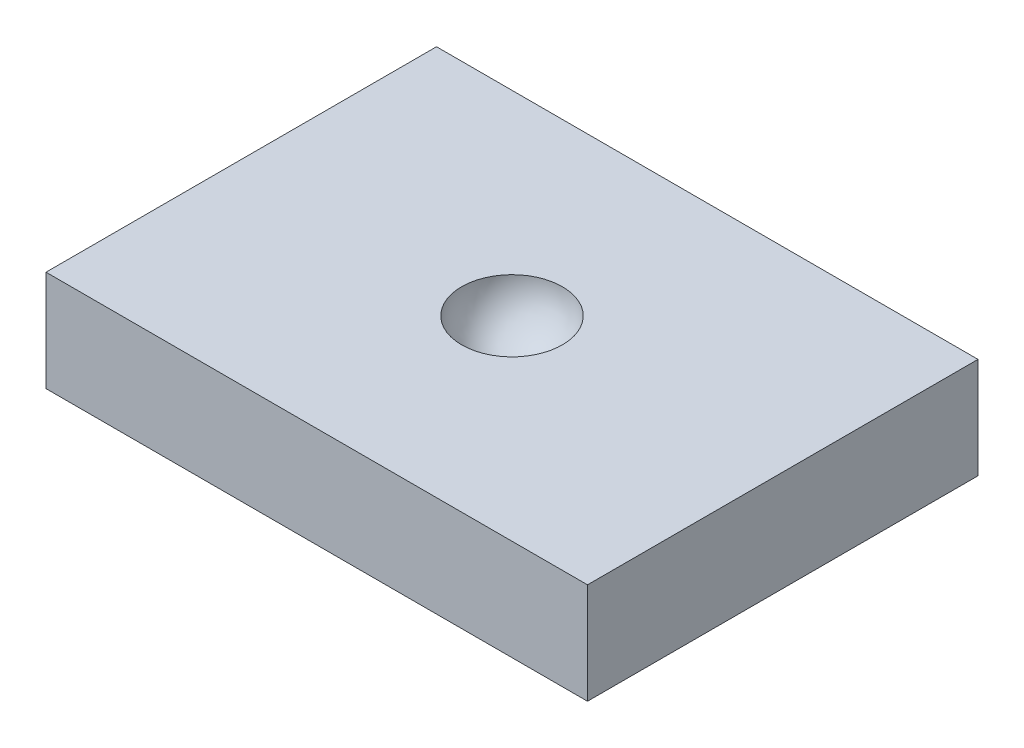
ISO-10303-21;
HEADER;
FILE_DESCRIPTION(('STEP AP214'),'2;1');
FILE_NAME('part.step','',(''),(''),'','','');
FILE_SCHEMA(('AUTOMOTIVE_DESIGN { 1 0 10303 214 1 1 1 1 }'));
ENDSEC;
DATA;
#1=APPLICATION_CONTEXT('core data for automotive mechanical design processes');
#2=APPLICATION_PROTOCOL_DEFINITION('international standard','automotive_design',2000,#1);
#3=PRODUCT_CONTEXT('',#1,'mechanical');
#4=PRODUCT('Part','Part','',(#3));
#5=PRODUCT_RELATED_PRODUCT_CATEGORY('part','',(#4));
#6=PRODUCT_DEFINITION_FORMATION('','',#4);
#7=PRODUCT_DEFINITION_CONTEXT('part definition',#1,'design');
#8=PRODUCT_DEFINITION('design','',#6,#7);
#9=PRODUCT_DEFINITION_SHAPE('','',#8);
#10=(LENGTH_UNIT() NAMED_UNIT(*) SI_UNIT(.MILLI.,.METRE.));
#11=(NAMED_UNIT(*) PLANE_ANGLE_UNIT() SI_UNIT($,.RADIAN.));
#12=(NAMED_UNIT(*) SI_UNIT($,.STERADIAN.) SOLID_ANGLE_UNIT());
#13=UNCERTAINTY_MEASURE_WITH_UNIT(LENGTH_MEASURE(1.E-05),#10,'distance_accuracy_value','');
#14=(GEOMETRIC_REPRESENTATION_CONTEXT(3) GLOBAL_UNCERTAINTY_ASSIGNED_CONTEXT((#13)) GLOBAL_UNIT_ASSIGNED_CONTEXT((#10,
#11,#12)) REPRESENTATION_CONTEXT('',''));
#15=CARTESIAN_POINT('',(0.,0.,0.));
#16=DIRECTION('',(0.,0.,1.));
#17=DIRECTION('',(1.,0.,0.));
#18=AXIS2_PLACEMENT_3D('',#15,#16,#17);
#19=CARTESIAN_POINT('',(0.,5.,0.));
#20=DIRECTION('',(-1.,0.,0.));
#21=DIRECTION('',(0.,0.,1.));
#22=AXIS2_PLACEMENT_3D('',#19,#20,#21);
#23=PLANE('',#22);
#24=DIRECTION('',(0.,0.,-1.));
#25=VECTOR('',#24,1.);
#26=CARTESIAN_POINT('',(0.,0.,0.));
#27=LINE('',#26,#25);
#28=CARTESIAN_POINT('',(0.,0.,0.));
#29=VERTEX_POINT('',#28);
#30=CARTESIAN_POINT('',(0.,0.,-19.3609094123086));
#31=VERTEX_POINT('',#30);
#32=EDGE_CURVE('E104',#29,#31,#27,.T.);
#33=ORIENTED_EDGE('',*,*,#32,.T.);
#34=DIRECTION('',(0.,-1.,0.));
#35=VECTOR('',#34,1.);
#36=CARTESIAN_POINT('',(0.,5.,-19.3609094123086));
#37=LINE('',#36,#35);
#38=CARTESIAN_POINT('',(0.,5.,-19.3609094123086));
#39=VERTEX_POINT('',#38);
#40=EDGE_CURVE('E11',#39,#31,#37,.T.);
#41=ORIENTED_EDGE('',*,*,#40,.F.);
#42=DIRECTION('',(0.,0.,-1.));
#43=VECTOR('',#42,1.);
#44=CARTESIAN_POINT('',(0.,5.,0.));
#45=LINE('',#44,#43);
#46=CARTESIAN_POINT('',(0.,5.,0.));
#47=VERTEX_POINT('',#46);
#48=EDGE_CURVE('E91',#47,#39,#45,.T.);
#49=ORIENTED_EDGE('',*,*,#48,.F.);
#50=DIRECTION('',(0.,-1.,0.));
#51=VECTOR('',#50,1.);
#52=CARTESIAN_POINT('',(0.,5.,0.));
#53=LINE('',#52,#51);
#54=EDGE_CURVE('E100',#47,#29,#53,.T.);
#55=ORIENTED_EDGE('',*,*,#54,.T.);
#56=EDGE_LOOP('',(#33,#41,#49,#55));
#57=FACE_BOUND('',#56,.T.);
#58=ADVANCED_FACE('F39',(#57),#23,.F.);
#59=CARTESIAN_POINT('',(0.,5.,-19.3609094123086));
#60=DIRECTION('',(0.,0.,1.));
#61=DIRECTION('',(1.,0.,0.));
#62=AXIS2_PLACEMENT_3D('',#59,#60,#61);
#63=PLANE('',#62);
#64=DIRECTION('',(-1.,0.,0.));
#65=VECTOR('',#64,1.);
#66=CARTESIAN_POINT('',(0.,0.,-19.3609094123086));
#67=LINE('',#66,#65);
#68=CARTESIAN_POINT('',(-26.8471277184013,0.,-19.3609094123086));
#69=VERTEX_POINT('',#68);
#70=EDGE_CURVE('E95',#31,#69,#67,.T.);
#71=ORIENTED_EDGE('',*,*,#70,.T.);
#72=DIRECTION('',(0.,-1.,0.));
#73=VECTOR('',#72,1.);
#74=CARTESIAN_POINT('',(-26.8471277184013,5.,-19.3609094123086));
#75=LINE('',#74,#73);
#76=CARTESIAN_POINT('',(-26.8471277184013,5.,-19.3609094123086));
#77=VERTEX_POINT('',#76);
#78=EDGE_CURVE('E48',#77,#69,#75,.T.);
#79=ORIENTED_EDGE('',*,*,#78,.F.);
#80=DIRECTION('',(-1.,0.,0.));
#81=VECTOR('',#80,1.);
#82=CARTESIAN_POINT('',(0.,5.,-19.3609094123086));
#83=LINE('',#82,#81);
#84=EDGE_CURVE('E86',#39,#77,#83,.T.);
#85=ORIENTED_EDGE('',*,*,#84,.F.);
#86=ORIENTED_EDGE('',*,*,#40,.T.);
#87=EDGE_LOOP('',(#71,#79,#85,#86));
#88=FACE_BOUND('',#87,.T.);
#89=ADVANCED_FACE('F94',(#88),#63,.F.);
#90=CARTESIAN_POINT('',(-26.8471277184013,5.,0.));
#91=DIRECTION('',(1.,0.,0.));
#92=DIRECTION('',(0.,0.,-1.));
#93=AXIS2_PLACEMENT_3D('',#90,#91,#92);
#94=PLANE('',#93);
#95=DIRECTION('',(0.,0.,1.));
#96=VECTOR('',#95,1.);
#97=CARTESIAN_POINT('',(-26.8471277184013,0.,0.));
#98=LINE('',#97,#96);
#99=CARTESIAN_POINT('',(-26.8471277184013,0.,0.));
#100=VERTEX_POINT('',#99);
#101=EDGE_CURVE('E73',#69,#100,#98,.T.);
#102=ORIENTED_EDGE('',*,*,#101,.T.);
#103=DIRECTION('',(0.,-1.,0.));
#104=VECTOR('',#103,1.);
#105=CARTESIAN_POINT('',(-26.8471277184013,5.,0.));
#106=LINE('',#105,#104);
#107=CARTESIAN_POINT('',(-26.8471277184013,5.,0.));
#108=VERTEX_POINT('',#107);
#109=EDGE_CURVE('E96',#108,#100,#106,.T.);
#110=ORIENTED_EDGE('',*,*,#109,.F.);
#111=DIRECTION('',(0.,0.,1.));
#112=VECTOR('',#111,1.);
#113=CARTESIAN_POINT('',(-26.8471277184013,5.,0.));
#114=LINE('',#113,#112);
#115=EDGE_CURVE('E89',#77,#108,#114,.T.);
#116=ORIENTED_EDGE('',*,*,#115,.F.);
#117=ORIENTED_EDGE('',*,*,#78,.T.);
#118=EDGE_LOOP('',(#102,#110,#116,#117));
#119=FACE_BOUND('',#118,.T.);
#120=ADVANCED_FACE('F98',(#119),#94,.F.);
#121=CARTESIAN_POINT('',(0.,5.,0.));
#122=DIRECTION('',(0.,0.,-1.));
#123=DIRECTION('',(-1.,0.,0.));
#124=AXIS2_PLACEMENT_3D('',#121,#122,#123);
#125=PLANE('',#124);
#126=DIRECTION('',(1.,0.,0.));
#127=VECTOR('',#126,1.);
#128=CARTESIAN_POINT('',(0.,0.,0.));
#129=LINE('',#128,#127);
#130=EDGE_CURVE('E79',#100,#29,#129,.T.);
#131=ORIENTED_EDGE('',*,*,#130,.T.);
#132=ORIENTED_EDGE('',*,*,#54,.F.);
#133=DIRECTION('',(1.,0.,0.));
#134=VECTOR('',#133,1.);
#135=CARTESIAN_POINT('',(0.,5.,0.));
#136=LINE('',#135,#134);
#137=EDGE_CURVE('E56',#108,#47,#136,.T.);
#138=ORIENTED_EDGE('',*,*,#137,.F.);
#139=ORIENTED_EDGE('',*,*,#109,.T.);
#140=EDGE_LOOP('',(#131,#132,#138,#139));
#141=FACE_BOUND('',#140,.T.);
#142=ADVANCED_FACE('F111',(#141),#125,.F.);
#143=CARTESIAN_POINT('',(0.,5.,0.));
#144=DIRECTION('',(0.,1.,0.));
#145=DIRECTION('',(0.,0.,1.));
#146=AXIS2_PLACEMENT_3D('',#143,#144,#145);
#147=PLANE('',#146);
#148=CARTESIAN_POINT('',(-13.4235638592007,5.,-9.68045470615431));
#149=DIRECTION('',(0.,1.,0.));
#150=DIRECTION('',(0.,0.,1.));
#151=AXIS2_PLACEMENT_3D('',#148,#149,#150);
#152=CIRCLE('',#151,2.49762347406788);
#153=CARTESIAN_POINT('',(-13.4235638592007,5.,-7.18283123208642));
#154=VERTEX_POINT('',#153);
#155=EDGE_CURVE('E42',#154,#154,#152,.F.);
#156=ORIENTED_EDGE('',*,*,#155,.T.);
#157=EDGE_LOOP('',(#156));
#158=FACE_BOUND('',#157,.T.);
#159=ORIENTED_EDGE('',*,*,#48,.T.);
#160=ORIENTED_EDGE('',*,*,#84,.T.);
#161=ORIENTED_EDGE('',*,*,#115,.T.);
#162=ORIENTED_EDGE('',*,*,#137,.T.);
#163=EDGE_LOOP('',(#159,#160,#161,#162));
#164=FACE_BOUND('',#163,.T.);
#165=ADVANCED_FACE('F87',(#158,#164),#147,.T.);
#166=CARTESIAN_POINT('',(0.,0.,0.));
#167=DIRECTION('',(0.,1.,0.));
#168=DIRECTION('',(0.,0.,1.));
#169=AXIS2_PLACEMENT_3D('',#166,#167,#168);
#170=PLANE('',#169);
#171=ORIENTED_EDGE('',*,*,#32,.F.);
#172=ORIENTED_EDGE('',*,*,#130,.F.);
#173=ORIENTED_EDGE('',*,*,#101,.F.);
#174=ORIENTED_EDGE('',*,*,#70,.F.);
#175=EDGE_LOOP('',(#171,#172,#173,#174));
#176=FACE_BOUND('',#175,.T.);
#177=ADVANCED_FACE('F114',(#176),#170,.F.);
#178=CARTESIAN_POINT('',(-13.4235638592007,5.,-9.68045470615431));
#179=DIRECTION('',(0.,0.,-1.));
#180=DIRECTION('',(1.,0.,0.));
#181=AXIS2_PLACEMENT_3D('',#178,#179,#180);
#182=SPHERICAL_SURFACE('',#181,2.49762347406788);
#183=CARTESIAN_POINT('',(-13.4235638592007,5.,-9.68045470615431));
#184=DIRECTION('',(0.,1.,0.));
#185=DIRECTION('',(0.,0.,1.));
#186=AXIS2_PLACEMENT_3D('',#183,#184,#185);
#187=SPHERICAL_SURFACE('',#186,2.49762347406788);
#188=ORIENTED_EDGE('',*,*,#155,.F.);
#189=EDGE_LOOP('',(#188));
#190=FACE_BOUND('',#189,.T.);
#191=ADVANCED_FACE('F129',(#190),#187,.F.);
#192=CLOSED_SHELL('',(#58,#89,#120,#142,#165,#177,#191));
#193=MANIFOLD_SOLID_BREP('B2',#192);
#194=ADVANCED_BREP_SHAPE_REPRESENTATION('',(#18,#193),#14);
#195=SHAPE_DEFINITION_REPRESENTATION(#9,#194);
ENDSEC;
END-ISO-10303-21;
